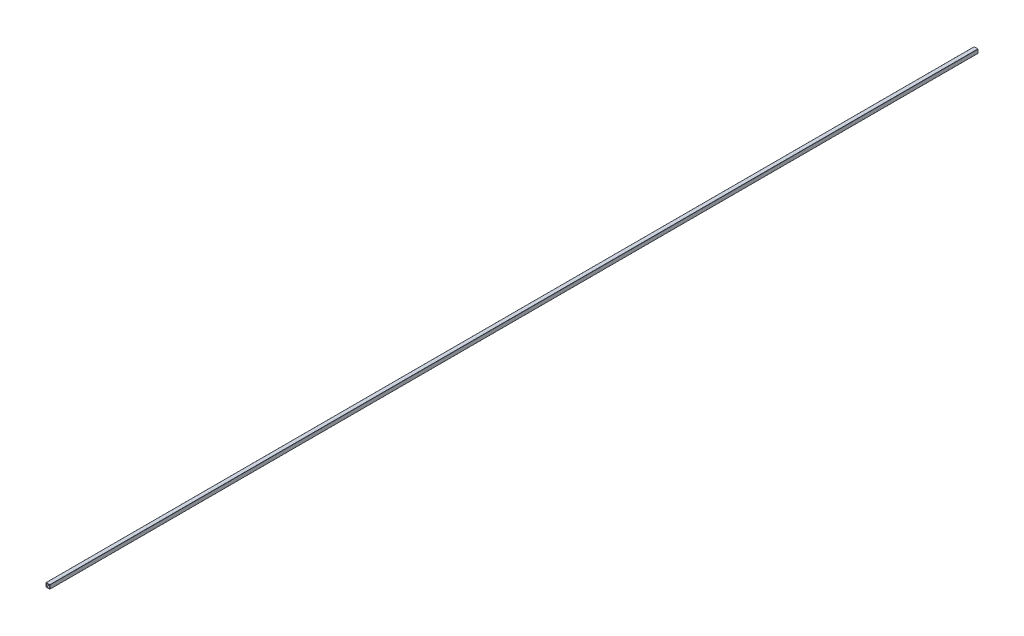
ISO-10303-21;
HEADER;
FILE_DESCRIPTION(('STEP AP214'),'2;1');
FILE_NAME('part.step','',(''),(''),'','','');
FILE_SCHEMA(('AUTOMOTIVE_DESIGN { 1 0 10303 214 1 1 1 1 }'));
ENDSEC;
DATA;
#1=APPLICATION_CONTEXT('core data for automotive mechanical design processes');
#2=APPLICATION_PROTOCOL_DEFINITION('international standard','automotive_design',2000,#1);
#3=PRODUCT_CONTEXT('',#1,'mechanical');
#4=PRODUCT('Part','Part','',(#3));
#5=PRODUCT_RELATED_PRODUCT_CATEGORY('part','',(#4));
#6=PRODUCT_DEFINITION_FORMATION('','',#4);
#7=PRODUCT_DEFINITION_CONTEXT('part definition',#1,'design');
#8=PRODUCT_DEFINITION('design','',#6,#7);
#9=PRODUCT_DEFINITION_SHAPE('','',#8);
#10=(LENGTH_UNIT() NAMED_UNIT(*) SI_UNIT(.MILLI.,.METRE.));
#11=(NAMED_UNIT(*) PLANE_ANGLE_UNIT() SI_UNIT($,.RADIAN.));
#12=(NAMED_UNIT(*) SI_UNIT($,.STERADIAN.) SOLID_ANGLE_UNIT());
#13=UNCERTAINTY_MEASURE_WITH_UNIT(LENGTH_MEASURE(1.E-05),#10,'distance_accuracy_value','');
#14=(GEOMETRIC_REPRESENTATION_CONTEXT(3) GLOBAL_UNCERTAINTY_ASSIGNED_CONTEXT((#13)) GLOBAL_UNIT_ASSIGNED_CONTEXT((#10,
#11,#12)) REPRESENTATION_CONTEXT('',''));
#15=CARTESIAN_POINT('',(0.,0.,0.));
#16=DIRECTION('',(0.,0.,1.));
#17=DIRECTION('',(1.,0.,0.));
#18=AXIS2_PLACEMENT_3D('',#15,#16,#17);
#19=CARTESIAN_POINT('',(11.7,11.7,6000.));
#20=DIRECTION('',(0.,0.,-1.));
#21=DIRECTION('',(-1.,0.,0.));
#22=AXIS2_PLACEMENT_3D('',#19,#20,#21);
#23=PLANE('',#22);
#24=CARTESIAN_POINT('',(11.7,11.7,6000.));
#25=DIRECTION('',(0.,0.,1.));
#26=DIRECTION('',(-1.,0.,0.));
#27=AXIS2_PLACEMENT_3D('',#24,#25,#26);
#28=CIRCLE('',#27,0.999999999999999);
#29=CARTESIAN_POINT('',(12.7,11.7,6000.));
#30=VERTEX_POINT('',#29);
#31=CARTESIAN_POINT('',(11.7,12.7,6000.));
#32=VERTEX_POINT('',#31);
#33=EDGE_CURVE('E158',#30,#32,#28,.T.);
#34=ORIENTED_EDGE('',*,*,#33,.T.);
#35=DIRECTION('',(-1.,0.,0.));
#36=VECTOR('',#35,1.);
#37=CARTESIAN_POINT('',(-11.7,12.7,6000.));
#38=LINE('',#37,#36);
#39=CARTESIAN_POINT('',(-11.7,12.7,6000.));
#40=VERTEX_POINT('',#39);
#41=EDGE_CURVE('E161',#32,#40,#38,.T.);
#42=ORIENTED_EDGE('',*,*,#41,.T.);
#43=CARTESIAN_POINT('',(-11.7,11.7,6000.));
#44=DIRECTION('',(0.,0.,1.));
#45=DIRECTION('',(-1.,0.,0.));
#46=AXIS2_PLACEMENT_3D('',#43,#44,#45);
#47=CIRCLE('',#46,0.999999999999999);
#48=CARTESIAN_POINT('',(-12.7,11.7,6000.));
#49=VERTEX_POINT('',#48);
#50=EDGE_CURVE('E164',#40,#49,#47,.T.);
#51=ORIENTED_EDGE('',*,*,#50,.T.);
#52=DIRECTION('',(0.,-1.,0.));
#53=VECTOR('',#52,1.);
#54=CARTESIAN_POINT('',(-12.7,-11.7,6000.));
#55=LINE('',#54,#53);
#56=CARTESIAN_POINT('',(-12.7,-11.7,6000.));
#57=VERTEX_POINT('',#56);
#58=EDGE_CURVE('E166',#49,#57,#55,.T.);
#59=ORIENTED_EDGE('',*,*,#58,.T.);
#60=CARTESIAN_POINT('',(-11.7,-11.7,6000.));
#61=DIRECTION('',(0.,0.,1.));
#62=DIRECTION('',(-1.,0.,0.));
#63=AXIS2_PLACEMENT_3D('',#60,#61,#62);
#64=CIRCLE('',#63,0.999999999999999);
#65=CARTESIAN_POINT('',(-11.7,-12.7,6000.));
#66=VERTEX_POINT('',#65);
#67=EDGE_CURVE('E168',#57,#66,#64,.T.);
#68=ORIENTED_EDGE('',*,*,#67,.T.);
#69=DIRECTION('',(1.,0.,0.));
#70=VECTOR('',#69,1.);
#71=CARTESIAN_POINT('',(-11.7,-12.7,6000.));
#72=LINE('',#71,#70);
#73=CARTESIAN_POINT('',(11.7,-12.7,6000.));
#74=VERTEX_POINT('',#73);
#75=EDGE_CURVE('E170',#66,#74,#72,.T.);
#76=ORIENTED_EDGE('',*,*,#75,.T.);
#77=CARTESIAN_POINT('',(11.7,-11.7,6000.));
#78=DIRECTION('',(0.,0.,1.));
#79=DIRECTION('',(1.,0.,0.));
#80=AXIS2_PLACEMENT_3D('',#77,#78,#79);
#81=CIRCLE('',#80,0.999999999999999);
#82=CARTESIAN_POINT('',(12.7,-11.7,6000.));
#83=VERTEX_POINT('',#82);
#84=EDGE_CURVE('E172',#74,#83,#81,.T.);
#85=ORIENTED_EDGE('',*,*,#84,.T.);
#86=DIRECTION('',(0.,1.,0.));
#87=VECTOR('',#86,1.);
#88=CARTESIAN_POINT('',(12.7,-11.7,6000.));
#89=LINE('',#88,#87);
#90=EDGE_CURVE('E174',#83,#30,#89,.T.);
#91=ORIENTED_EDGE('',*,*,#90,.T.);
#92=EDGE_LOOP('',(#34,#42,#51,#59,#68,#76,#85,#91));
#93=FACE_BOUND('',#92,.T.);
#94=DIRECTION('',(1.,0.,0.));
#95=VECTOR('',#94,1.);
#96=CARTESIAN_POINT('',(-10.04,-10.04,6000.));
#97=LINE('',#96,#95);
#98=CARTESIAN_POINT('',(-10.04,-10.04,6000.));
#99=VERTEX_POINT('',#98);
#100=CARTESIAN_POINT('',(10.04,-10.04,6000.));
#101=VERTEX_POINT('',#100);
#102=EDGE_CURVE('E122',#99,#101,#97,.T.);
#103=ORIENTED_EDGE('',*,*,#102,.F.);
#104=DIRECTION('',(0.,-1.,0.));
#105=VECTOR('',#104,1.);
#106=CARTESIAN_POINT('',(-10.04,-10.04,6000.));
#107=LINE('',#106,#105);
#108=CARTESIAN_POINT('',(-10.04,10.04,6000.));
#109=VERTEX_POINT('',#108);
#110=EDGE_CURVE('E144',#109,#99,#107,.T.);
#111=ORIENTED_EDGE('',*,*,#110,.F.);
#112=DIRECTION('',(-1.,0.,0.));
#113=VECTOR('',#112,1.);
#114=CARTESIAN_POINT('',(-10.04,10.04,6000.));
#115=LINE('',#114,#113);
#116=CARTESIAN_POINT('',(10.04,10.04,6000.));
#117=VERTEX_POINT('',#116);
#118=EDGE_CURVE('E142',#117,#109,#115,.T.);
#119=ORIENTED_EDGE('',*,*,#118,.F.);
#120=DIRECTION('',(0.,1.,0.));
#121=VECTOR('',#120,1.);
#122=CARTESIAN_POINT('',(10.04,-10.04,6000.));
#123=LINE('',#122,#121);
#124=EDGE_CURVE('E130',#101,#117,#123,.T.);
#125=ORIENTED_EDGE('',*,*,#124,.F.);
#126=EDGE_LOOP('',(#103,#111,#119,#125));
#127=FACE_BOUND('',#126,.T.);
#128=ADVANCED_FACE('F33',(#93,#127),#23,.F.);
#129=CARTESIAN_POINT('',(11.7,11.7,0.));
#130=DIRECTION('',(0.,0.,-1.));
#131=DIRECTION('',(-1.,0.,0.));
#132=AXIS2_PLACEMENT_3D('',#129,#130,#131);
#133=PLANE('',#132);
#134=CARTESIAN_POINT('',(11.7,11.7,0.));
#135=DIRECTION('',(0.,0.,1.));
#136=DIRECTION('',(-1.,0.,0.));
#137=AXIS2_PLACEMENT_3D('',#134,#135,#136);
#138=CIRCLE('',#137,0.999999999999999);
#139=CARTESIAN_POINT('',(12.7,11.7,0.));
#140=VERTEX_POINT('',#139);
#141=CARTESIAN_POINT('',(11.7,12.7,0.));
#142=VERTEX_POINT('',#141);
#143=EDGE_CURVE('E138',#140,#142,#138,.T.);
#144=ORIENTED_EDGE('',*,*,#143,.F.);
#145=DIRECTION('',(0.,1.,0.));
#146=VECTOR('',#145,1.);
#147=CARTESIAN_POINT('',(12.7,-11.7,0.));
#148=LINE('',#147,#146);
#149=CARTESIAN_POINT('',(12.7,-11.7,0.));
#150=VERTEX_POINT('',#149);
#151=EDGE_CURVE('E162',#150,#140,#148,.T.);
#152=ORIENTED_EDGE('',*,*,#151,.F.);
#153=CARTESIAN_POINT('',(11.7,-11.7,0.));
#154=DIRECTION('',(0.,0.,1.));
#155=DIRECTION('',(1.,0.,0.));
#156=AXIS2_PLACEMENT_3D('',#153,#154,#155);
#157=CIRCLE('',#156,0.999999999999999);
#158=CARTESIAN_POINT('',(11.7,-12.7,0.));
#159=VERTEX_POINT('',#158);
#160=EDGE_CURVE('E189',#159,#150,#157,.T.);
#161=ORIENTED_EDGE('',*,*,#160,.F.);
#162=DIRECTION('',(1.,0.,0.));
#163=VECTOR('',#162,1.);
#164=CARTESIAN_POINT('',(-11.7,-12.7,0.));
#165=LINE('',#164,#163);
#166=CARTESIAN_POINT('',(-11.7,-12.7,0.));
#167=VERTEX_POINT('',#166);
#168=EDGE_CURVE('E187',#167,#159,#165,.T.);
#169=ORIENTED_EDGE('',*,*,#168,.F.);
#170=CARTESIAN_POINT('',(-11.7,-11.7,0.));
#171=DIRECTION('',(0.,0.,1.));
#172=DIRECTION('',(-1.,0.,0.));
#173=AXIS2_PLACEMENT_3D('',#170,#171,#172);
#174=CIRCLE('',#173,0.999999999999999);
#175=CARTESIAN_POINT('',(-12.7,-11.7,0.));
#176=VERTEX_POINT('',#175);
#177=EDGE_CURVE('E185',#176,#167,#174,.T.);
#178=ORIENTED_EDGE('',*,*,#177,.F.);
#179=DIRECTION('',(0.,-1.,0.));
#180=VECTOR('',#179,1.);
#181=CARTESIAN_POINT('',(-12.7,-11.7,0.));
#182=LINE('',#181,#180);
#183=CARTESIAN_POINT('',(-12.7,11.7,0.));
#184=VERTEX_POINT('',#183);
#185=EDGE_CURVE('E183',#184,#176,#182,.T.);
#186=ORIENTED_EDGE('',*,*,#185,.F.);
#187=CARTESIAN_POINT('',(-11.7,11.7,0.));
#188=DIRECTION('',(0.,0.,1.));
#189=DIRECTION('',(-1.,0.,0.));
#190=AXIS2_PLACEMENT_3D('',#187,#188,#189);
#191=CIRCLE('',#190,0.999999999999999);
#192=CARTESIAN_POINT('',(-11.7,12.7,0.));
#193=VERTEX_POINT('',#192);
#194=EDGE_CURVE('E181',#193,#184,#191,.T.);
#195=ORIENTED_EDGE('',*,*,#194,.F.);
#196=DIRECTION('',(-1.,0.,0.));
#197=VECTOR('',#196,1.);
#198=CARTESIAN_POINT('',(-11.7,12.7,0.));
#199=LINE('',#198,#197);
#200=EDGE_CURVE('E179',#142,#193,#199,.T.);
#201=ORIENTED_EDGE('',*,*,#200,.F.);
#202=EDGE_LOOP('',(#144,#152,#161,#169,#178,#186,#195,#201));
#203=FACE_BOUND('',#202,.T.);
#204=DIRECTION('',(0.,-1.,0.));
#205=VECTOR('',#204,1.);
#206=CARTESIAN_POINT('',(-10.04,-10.04,0.));
#207=LINE('',#206,#205);
#208=CARTESIAN_POINT('',(-10.04,10.04,0.));
#209=VERTEX_POINT('',#208);
#210=CARTESIAN_POINT('',(-10.04,-10.04,0.));
#211=VERTEX_POINT('',#210);
#212=EDGE_CURVE('E131',#209,#211,#207,.T.);
#213=ORIENTED_EDGE('',*,*,#212,.T.);
#214=DIRECTION('',(1.,0.,0.));
#215=VECTOR('',#214,1.);
#216=CARTESIAN_POINT('',(-10.04,-10.04,0.));
#217=LINE('',#216,#215);
#218=CARTESIAN_POINT('',(10.04,-10.04,0.));
#219=VERTEX_POINT('',#218);
#220=EDGE_CURVE('E56',#211,#219,#217,.T.);
#221=ORIENTED_EDGE('',*,*,#220,.T.);
#222=DIRECTION('',(0.,1.,0.));
#223=VECTOR('',#222,1.);
#224=CARTESIAN_POINT('',(10.04,-10.04,0.));
#225=LINE('',#224,#223);
#226=CARTESIAN_POINT('',(10.04,10.04,0.));
#227=VERTEX_POINT('',#226);
#228=EDGE_CURVE('E137',#219,#227,#225,.T.);
#229=ORIENTED_EDGE('',*,*,#228,.T.);
#230=DIRECTION('',(-1.,0.,0.));
#231=VECTOR('',#230,1.);
#232=CARTESIAN_POINT('',(-10.04,10.04,0.));
#233=LINE('',#232,#231);
#234=EDGE_CURVE('E150',#227,#209,#233,.T.);
#235=ORIENTED_EDGE('',*,*,#234,.T.);
#236=EDGE_LOOP('',(#213,#221,#229,#235));
#237=FACE_BOUND('',#236,.T.);
#238=ADVANCED_FACE('F219',(#203,#237),#133,.T.);
#239=CARTESIAN_POINT('',(11.7,11.7,6000.));
#240=DIRECTION('',(0.,0.,-1.));
#241=DIRECTION('',(-1.,0.,0.));
#242=AXIS2_PLACEMENT_3D('',#239,#240,#241);
#243=CYLINDRICAL_SURFACE('',#242,0.999999999999999);
#244=ORIENTED_EDGE('',*,*,#143,.T.);
#245=DIRECTION('',(0.,0.,-1.));
#246=VECTOR('',#245,1.);
#247=CARTESIAN_POINT('',(11.7,12.7,6000.));
#248=LINE('',#247,#246);
#249=EDGE_CURVE('E11',#32,#142,#248,.T.);
#250=ORIENTED_EDGE('',*,*,#249,.F.);
#251=ORIENTED_EDGE('',*,*,#33,.F.);
#252=DIRECTION('',(0.,0.,-1.));
#253=VECTOR('',#252,1.);
#254=CARTESIAN_POINT('',(12.7,11.7,6000.));
#255=LINE('',#254,#253);
#256=EDGE_CURVE('E176',#30,#140,#255,.T.);
#257=ORIENTED_EDGE('',*,*,#256,.T.);
#258=EDGE_LOOP('',(#244,#250,#251,#257));
#259=FACE_BOUND('',#258,.T.);
#260=ADVANCED_FACE('F35',(#259),#243,.T.);
#261=CARTESIAN_POINT('',(-11.7,12.7,6000.));
#262=DIRECTION('',(0.,-1.,0.));
#263=DIRECTION('',(0.,0.,-1.));
#264=AXIS2_PLACEMENT_3D('',#261,#262,#263);
#265=PLANE('',#264);
#266=ORIENTED_EDGE('',*,*,#200,.T.);
#267=DIRECTION('',(0.,0.,-1.));
#268=VECTOR('',#267,1.);
#269=CARTESIAN_POINT('',(-11.7,12.7,6000.));
#270=LINE('',#269,#268);
#271=EDGE_CURVE('E41',#40,#193,#270,.T.);
#272=ORIENTED_EDGE('',*,*,#271,.F.);
#273=ORIENTED_EDGE('',*,*,#41,.F.);
#274=ORIENTED_EDGE('',*,*,#249,.T.);
#275=EDGE_LOOP('',(#266,#272,#273,#274));
#276=FACE_BOUND('',#275,.T.);
#277=ADVANCED_FACE('F236',(#276),#265,.F.);
#278=CARTESIAN_POINT('',(-11.7,11.7,6000.));
#279=DIRECTION('',(0.,0.,-1.));
#280=DIRECTION('',(-1.,0.,0.));
#281=AXIS2_PLACEMENT_3D('',#278,#279,#280);
#282=CYLINDRICAL_SURFACE('',#281,0.999999999999999);
#283=ORIENTED_EDGE('',*,*,#194,.T.);
#284=DIRECTION('',(0.,0.,-1.));
#285=VECTOR('',#284,1.);
#286=CARTESIAN_POINT('',(-12.7,11.7,6000.));
#287=LINE('',#286,#285);
#288=EDGE_CURVE('E206',#49,#184,#287,.T.);
#289=ORIENTED_EDGE('',*,*,#288,.F.);
#290=ORIENTED_EDGE('',*,*,#50,.F.);
#291=ORIENTED_EDGE('',*,*,#271,.T.);
#292=EDGE_LOOP('',(#283,#289,#290,#291));
#293=FACE_BOUND('',#292,.T.);
#294=ADVANCED_FACE('F213',(#293),#282,.T.);
#295=CARTESIAN_POINT('',(-12.7,-11.7,6000.));
#296=DIRECTION('',(1.,0.,0.));
#297=DIRECTION('',(0.,0.,-1.));
#298=AXIS2_PLACEMENT_3D('',#295,#296,#297);
#299=PLANE('',#298);
#300=ORIENTED_EDGE('',*,*,#185,.T.);
#301=DIRECTION('',(0.,0.,-1.));
#302=VECTOR('',#301,1.);
#303=CARTESIAN_POINT('',(-12.7,-11.7,6000.));
#304=LINE('',#303,#302);
#305=EDGE_CURVE('E203',#57,#176,#304,.T.);
#306=ORIENTED_EDGE('',*,*,#305,.F.);
#307=ORIENTED_EDGE('',*,*,#58,.F.);
#308=ORIENTED_EDGE('',*,*,#288,.T.);
#309=EDGE_LOOP('',(#300,#306,#307,#308));
#310=FACE_BOUND('',#309,.T.);
#311=ADVANCED_FACE('F225',(#310),#299,.F.);
#312=CARTESIAN_POINT('',(-11.7,-11.7,6000.));
#313=DIRECTION('',(0.,0.,-1.));
#314=DIRECTION('',(-1.,0.,0.));
#315=AXIS2_PLACEMENT_3D('',#312,#313,#314);
#316=CYLINDRICAL_SURFACE('',#315,0.999999999999999);
#317=ORIENTED_EDGE('',*,*,#177,.T.);
#318=DIRECTION('',(0.,0.,-1.));
#319=VECTOR('',#318,1.);
#320=CARTESIAN_POINT('',(-11.7,-12.7,6000.));
#321=LINE('',#320,#319);
#322=EDGE_CURVE('E200',#66,#167,#321,.T.);
#323=ORIENTED_EDGE('',*,*,#322,.F.);
#324=ORIENTED_EDGE('',*,*,#67,.F.);
#325=ORIENTED_EDGE('',*,*,#305,.T.);
#326=EDGE_LOOP('',(#317,#323,#324,#325));
#327=FACE_BOUND('',#326,.T.);
#328=ADVANCED_FACE('F229',(#327),#316,.T.);
#329=CARTESIAN_POINT('',(-11.7,-12.7,6000.));
#330=DIRECTION('',(0.,1.,0.));
#331=DIRECTION('',(0.,0.,1.));
#332=AXIS2_PLACEMENT_3D('',#329,#330,#331);
#333=PLANE('',#332);
#334=ORIENTED_EDGE('',*,*,#168,.T.);
#335=DIRECTION('',(0.,0.,-1.));
#336=VECTOR('',#335,1.);
#337=CARTESIAN_POINT('',(11.7,-12.7,6000.));
#338=LINE('',#337,#336);
#339=EDGE_CURVE('E197',#74,#159,#338,.T.);
#340=ORIENTED_EDGE('',*,*,#339,.F.);
#341=ORIENTED_EDGE('',*,*,#75,.F.);
#342=ORIENTED_EDGE('',*,*,#322,.T.);
#343=EDGE_LOOP('',(#334,#340,#341,#342));
#344=FACE_BOUND('',#343,.T.);
#345=ADVANCED_FACE('F249',(#344),#333,.F.);
#346=CARTESIAN_POINT('',(11.7,-11.7,6000.));
#347=DIRECTION('',(0.,0.,-1.));
#348=DIRECTION('',(-1.,0.,0.));
#349=AXIS2_PLACEMENT_3D('',#346,#347,#348);
#350=CYLINDRICAL_SURFACE('',#349,0.999999999999999);
#351=ORIENTED_EDGE('',*,*,#160,.T.);
#352=DIRECTION('',(0.,0.,-1.));
#353=VECTOR('',#352,1.);
#354=CARTESIAN_POINT('',(12.7,-11.7,6000.));
#355=LINE('',#354,#353);
#356=EDGE_CURVE('E194',#83,#150,#355,.T.);
#357=ORIENTED_EDGE('',*,*,#356,.F.);
#358=ORIENTED_EDGE('',*,*,#84,.F.);
#359=ORIENTED_EDGE('',*,*,#339,.T.);
#360=EDGE_LOOP('',(#351,#357,#358,#359));
#361=FACE_BOUND('',#360,.T.);
#362=ADVANCED_FACE('F247',(#361),#350,.T.);
#363=CARTESIAN_POINT('',(12.7,-11.7,6000.));
#364=DIRECTION('',(-1.,0.,0.));
#365=DIRECTION('',(0.,0.,1.));
#366=AXIS2_PLACEMENT_3D('',#363,#364,#365);
#367=PLANE('',#366);
#368=ORIENTED_EDGE('',*,*,#151,.T.);
#369=ORIENTED_EDGE('',*,*,#256,.F.);
#370=ORIENTED_EDGE('',*,*,#90,.F.);
#371=ORIENTED_EDGE('',*,*,#356,.T.);
#372=EDGE_LOOP('',(#368,#369,#370,#371));
#373=FACE_BOUND('',#372,.T.);
#374=ADVANCED_FACE('F242',(#373),#367,.F.);
#375=CARTESIAN_POINT('',(-10.04,-10.04,6000.));
#376=DIRECTION('',(0.,1.,0.));
#377=DIRECTION('',(0.,0.,1.));
#378=AXIS2_PLACEMENT_3D('',#375,#376,#377);
#379=PLANE('',#378);
#380=ORIENTED_EDGE('',*,*,#220,.F.);
#381=DIRECTION('',(0.,0.,-1.));
#382=VECTOR('',#381,1.);
#383=CARTESIAN_POINT('',(-10.04,-10.04,6000.));
#384=LINE('',#383,#382);
#385=EDGE_CURVE('E126',#99,#211,#384,.T.);
#386=ORIENTED_EDGE('',*,*,#385,.F.);
#387=ORIENTED_EDGE('',*,*,#102,.T.);
#388=DIRECTION('',(0.,0.,-1.));
#389=VECTOR('',#388,1.);
#390=CARTESIAN_POINT('',(10.04,-10.04,6000.));
#391=LINE('',#390,#389);
#392=EDGE_CURVE('E125',#101,#219,#391,.T.);
#393=ORIENTED_EDGE('',*,*,#392,.T.);
#394=EDGE_LOOP('',(#380,#386,#387,#393));
#395=FACE_BOUND('',#394,.T.);
#396=ADVANCED_FACE('F124',(#395),#379,.T.);
#397=CARTESIAN_POINT('',(10.04,-10.04,6000.));
#398=DIRECTION('',(-1.,0.,0.));
#399=DIRECTION('',(0.,-1.,0.));
#400=AXIS2_PLACEMENT_3D('',#397,#398,#399);
#401=PLANE('',#400);
#402=ORIENTED_EDGE('',*,*,#228,.F.);
#403=ORIENTED_EDGE('',*,*,#392,.F.);
#404=ORIENTED_EDGE('',*,*,#124,.T.);
#405=DIRECTION('',(0.,0.,-1.));
#406=VECTOR('',#405,1.);
#407=CARTESIAN_POINT('',(10.04,10.04,6000.));
#408=LINE('',#407,#406);
#409=EDGE_CURVE('E139',#117,#227,#408,.T.);
#410=ORIENTED_EDGE('',*,*,#409,.T.);
#411=EDGE_LOOP('',(#402,#403,#404,#410));
#412=FACE_BOUND('',#411,.T.);
#413=ADVANCED_FACE('F134',(#412),#401,.T.);
#414=CARTESIAN_POINT('',(-10.04,10.04,6000.));
#415=DIRECTION('',(0.,-1.,0.));
#416=DIRECTION('',(0.,0.,-1.));
#417=AXIS2_PLACEMENT_3D('',#414,#415,#416);
#418=PLANE('',#417);
#419=ORIENTED_EDGE('',*,*,#234,.F.);
#420=ORIENTED_EDGE('',*,*,#409,.F.);
#421=ORIENTED_EDGE('',*,*,#118,.T.);
#422=DIRECTION('',(0.,0.,-1.));
#423=VECTOR('',#422,1.);
#424=CARTESIAN_POINT('',(-10.04,10.04,6000.));
#425=LINE('',#424,#423);
#426=EDGE_CURVE('E48',#109,#209,#425,.T.);
#427=ORIENTED_EDGE('',*,*,#426,.T.);
#428=EDGE_LOOP('',(#419,#420,#421,#427));
#429=FACE_BOUND('',#428,.T.);
#430=ADVANCED_FACE('F274',(#429),#418,.T.);
#431=CARTESIAN_POINT('',(-10.04,-10.04,6000.));
#432=DIRECTION('',(1.,0.,0.));
#433=DIRECTION('',(0.,0.,-1.));
#434=AXIS2_PLACEMENT_3D('',#431,#432,#433);
#435=PLANE('',#434);
#436=ORIENTED_EDGE('',*,*,#212,.F.);
#437=ORIENTED_EDGE('',*,*,#426,.F.);
#438=ORIENTED_EDGE('',*,*,#110,.T.);
#439=ORIENTED_EDGE('',*,*,#385,.T.);
#440=EDGE_LOOP('',(#436,#437,#438,#439));
#441=FACE_BOUND('',#440,.T.);
#442=ADVANCED_FACE('F278',(#441),#435,.T.);
#443=CLOSED_SHELL('',(#128,#238,#260,#277,#294,#311,#328,#345,#362,#374,#396,#413,#430,#442));
#444=MANIFOLD_SOLID_BREP('B2',#443);
#445=ADVANCED_BREP_SHAPE_REPRESENTATION('',(#18,#444),#14);
#446=SHAPE_DEFINITION_REPRESENTATION(#9,#445);
ENDSEC;
END-ISO-10303-21;
